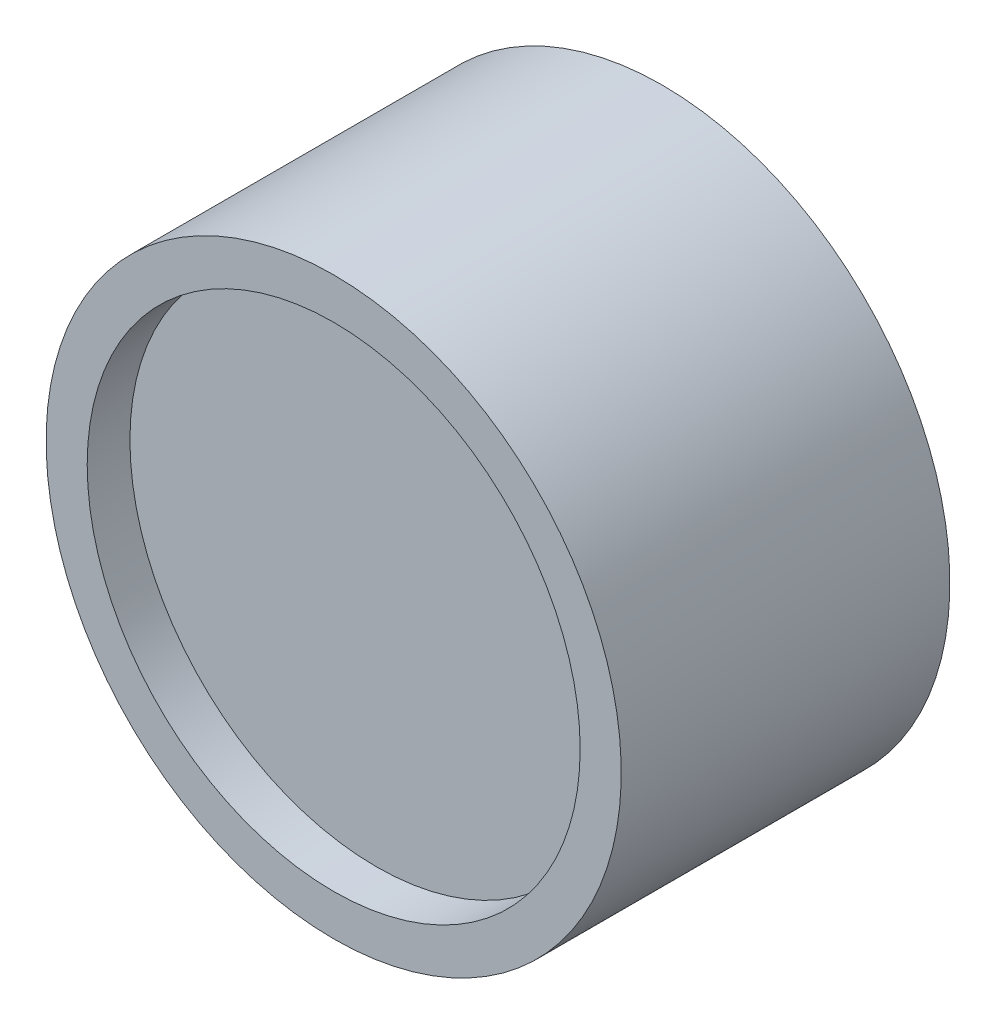
ISO-10303-21;
HEADER;
FILE_DESCRIPTION(('STEP AP214'),'2;1');
FILE_NAME('part.step','',(''),(''),'','','');
FILE_SCHEMA(('AUTOMOTIVE_DESIGN { 1 0 10303 214 1 1 1 1 }'));
ENDSEC;
DATA;
#1=APPLICATION_CONTEXT('core data for automotive mechanical design processes');
#2=APPLICATION_PROTOCOL_DEFINITION('international standard','automotive_design',2000,#1);
#3=PRODUCT_CONTEXT('',#1,'mechanical');
#4=PRODUCT('Part','Part','',(#3));
#5=PRODUCT_RELATED_PRODUCT_CATEGORY('part','',(#4));
#6=PRODUCT_DEFINITION_FORMATION('','',#4);
#7=PRODUCT_DEFINITION_CONTEXT('part definition',#1,'design');
#8=PRODUCT_DEFINITION('design','',#6,#7);
#9=PRODUCT_DEFINITION_SHAPE('','',#8);
#10=(LENGTH_UNIT() NAMED_UNIT(*) SI_UNIT(.MILLI.,.METRE.));
#11=(NAMED_UNIT(*) PLANE_ANGLE_UNIT() SI_UNIT($,.RADIAN.));
#12=(NAMED_UNIT(*) SI_UNIT($,.STERADIAN.) SOLID_ANGLE_UNIT());
#13=UNCERTAINTY_MEASURE_WITH_UNIT(LENGTH_MEASURE(1.E-05),#10,'distance_accuracy_value','');
#14=(GEOMETRIC_REPRESENTATION_CONTEXT(3) GLOBAL_UNCERTAINTY_ASSIGNED_CONTEXT((#13)) GLOBAL_UNIT_ASSIGNED_CONTEXT((#10,
#11,#12)) REPRESENTATION_CONTEXT('',''));
#15=CARTESIAN_POINT('',(0.,0.,0.));
#16=DIRECTION('',(0.,0.,1.));
#17=DIRECTION('',(1.,0.,0.));
#18=AXIS2_PLACEMENT_3D('',#15,#16,#17);
#19=CARTESIAN_POINT('',(0.,22.225,12.7));
#20=DIRECTION('',(0.,0.,-1.));
#21=DIRECTION('',(0.,1.,0.));
#22=AXIS2_PLACEMENT_3D('',#19,#20,#21);
#23=PLANE('',#22);
#24=CARTESIAN_POINT('',(0.,0.,12.7));
#25=DIRECTION('',(0.,0.,1.));
#26=DIRECTION('',(0.,-1.,0.));
#27=AXIS2_PLACEMENT_3D('',#24,#25,#26);
#28=CIRCLE('',#27,19.05);
#29=CARTESIAN_POINT('',(0.,-19.05,12.7));
#30=VERTEX_POINT('',#29);
#31=EDGE_CURVE('E53',#30,#30,#28,.T.);
#32=ORIENTED_EDGE('',*,*,#31,.F.);
#33=EDGE_LOOP('',(#32));
#34=FACE_BOUND('',#33,.T.);
#35=CARTESIAN_POINT('',(0.,0.,12.7));
#36=DIRECTION('',(0.,0.,1.));
#37=DIRECTION('',(0.,-1.,0.));
#38=AXIS2_PLACEMENT_3D('',#35,#36,#37);
#39=CIRCLE('',#38,22.225);
#40=CARTESIAN_POINT('',(0.,-22.225,12.7));
#41=VERTEX_POINT('',#40);
#42=EDGE_CURVE('E66',#41,#41,#39,.T.);
#43=ORIENTED_EDGE('',*,*,#42,.T.);
#44=EDGE_LOOP('',(#43));
#45=FACE_BOUND('',#44,.T.);
#46=ADVANCED_FACE('F41',(#34,#45),#23,.F.);
#47=CARTESIAN_POINT('',(0.,0.,9.398));
#48=DIRECTION('',(0.,0.,1.));
#49=DIRECTION('',(0.,-1.,0.));
#50=AXIS2_PLACEMENT_3D('',#47,#48,#49);
#51=CYLINDRICAL_SURFACE('',#50,19.05);
#52=CARTESIAN_POINT('',(0.,0.,9.398));
#53=DIRECTION('',(0.,0.,1.));
#54=DIRECTION('',(0.,-1.,0.));
#55=AXIS2_PLACEMENT_3D('',#52,#53,#54);
#56=CIRCLE('',#55,19.05);
#57=CARTESIAN_POINT('',(0.,-19.05,9.398));
#58=VERTEX_POINT('',#57);
#59=EDGE_CURVE('E85',#58,#58,#56,.T.);
#60=ORIENTED_EDGE('',*,*,#59,.F.);
#61=EDGE_LOOP('',(#60));
#62=FACE_BOUND('',#61,.T.);
#63=ORIENTED_EDGE('',*,*,#31,.T.);
#64=EDGE_LOOP('',(#63));
#65=FACE_BOUND('',#64,.T.);
#66=ADVANCED_FACE('F93',(#62,#65),#51,.F.);
#67=CARTESIAN_POINT('',(0.,19.05,9.398));
#68=DIRECTION('',(0.,0.,-1.));
#69=DIRECTION('',(0.,1.,0.));
#70=AXIS2_PLACEMENT_3D('',#67,#68,#69);
#71=PLANE('',#70);
#72=ORIENTED_EDGE('',*,*,#59,.T.);
#73=EDGE_LOOP('',(#72));
#74=FACE_BOUND('',#73,.T.);
#75=ADVANCED_FACE('F119',(#74),#71,.F.);
#76=CARTESIAN_POINT('',(0.,0.,-9.398));
#77=DIRECTION('',(0.,0.,1.));
#78=DIRECTION('',(0.,-1.,0.));
#79=AXIS2_PLACEMENT_3D('',#76,#77,#78);
#80=PLANE('',#79);
#81=CARTESIAN_POINT('',(0.,0.,-9.398));
#82=DIRECTION('',(0.,0.,1.));
#83=DIRECTION('',(0.,-1.,0.));
#84=AXIS2_PLACEMENT_3D('',#81,#82,#83);
#85=CIRCLE('',#84,19.05);
#86=CARTESIAN_POINT('',(0.,-19.05,-9.398));
#87=VERTEX_POINT('',#86);
#88=EDGE_CURVE('E81',#87,#87,#85,.T.);
#89=ORIENTED_EDGE('',*,*,#88,.F.);
#90=EDGE_LOOP('',(#89));
#91=FACE_BOUND('',#90,.T.);
#92=ADVANCED_FACE('F114',(#91),#80,.F.);
#93=CARTESIAN_POINT('',(0.,0.,9.398));
#94=DIRECTION('',(0.,0.,1.));
#95=DIRECTION('',(0.,-1.,0.));
#96=AXIS2_PLACEMENT_3D('',#93,#94,#95);
#97=CYLINDRICAL_SURFACE('',#96,19.05);
#98=CARTESIAN_POINT('',(0.,0.,-12.7));
#99=DIRECTION('',(0.,0.,1.));
#100=DIRECTION('',(0.,-1.,0.));
#101=AXIS2_PLACEMENT_3D('',#98,#99,#100);
#102=CIRCLE('',#101,19.05);
#103=CARTESIAN_POINT('',(0.,-19.05,-12.7));
#104=VERTEX_POINT('',#103);
#105=EDGE_CURVE('E77',#104,#104,#102,.T.);
#106=ORIENTED_EDGE('',*,*,#105,.F.);
#107=EDGE_LOOP('',(#106));
#108=FACE_BOUND('',#107,.T.);
#109=ORIENTED_EDGE('',*,*,#88,.T.);
#110=EDGE_LOOP('',(#109));
#111=FACE_BOUND('',#110,.T.);
#112=ADVANCED_FACE('F108',(#108,#111),#97,.F.);
#113=CARTESIAN_POINT('',(0.,19.05,-12.7));
#114=DIRECTION('',(0.,0.,1.));
#115=DIRECTION('',(0.,-1.,0.));
#116=AXIS2_PLACEMENT_3D('',#113,#114,#115);
#117=PLANE('',#116);
#118=CARTESIAN_POINT('',(0.,0.,-12.7));
#119=DIRECTION('',(0.,0.,1.));
#120=DIRECTION('',(0.,-1.,0.));
#121=AXIS2_PLACEMENT_3D('',#118,#119,#120);
#122=CIRCLE('',#121,22.225);
#123=CARTESIAN_POINT('',(0.,-22.225,-12.7));
#124=VERTEX_POINT('',#123);
#125=EDGE_CURVE('E71',#124,#124,#122,.T.);
#126=ORIENTED_EDGE('',*,*,#125,.F.);
#127=EDGE_LOOP('',(#126));
#128=FACE_BOUND('',#127,.T.);
#129=ORIENTED_EDGE('',*,*,#105,.T.);
#130=EDGE_LOOP('',(#129));
#131=FACE_BOUND('',#130,.T.);
#132=ADVANCED_FACE('F102',(#128,#131),#117,.F.);
#133=CARTESIAN_POINT('',(0.,0.,9.398));
#134=DIRECTION('',(0.,0.,1.));
#135=DIRECTION('',(0.,-1.,0.));
#136=AXIS2_PLACEMENT_3D('',#133,#134,#135);
#137=CYLINDRICAL_SURFACE('',#136,22.225);
#138=CARTESIAN_POINT('',(0.,-22.225,-1.5875));
#139=CARTESIAN_POINT('',(-0.0890487798453097,-22.2249992505102,-1.58749609264575));
#140=CARTESIAN_POINT('',(-0.178159230469295,-22.2244590967661,-1.57998219641667));
#141=CARTESIAN_POINT('',(-0.353917635489172,-22.2223562476493,-1.55011672192261));
#142=CARTESIAN_POINT('',(-0.440562633778054,-22.2207923746226,-1.52774805477269));
#143=CARTESIAN_POINT('',(-0.608818958371997,-22.2168189279091,-1.46882052945945));
#144=CARTESIAN_POINT('',(-0.690432988297746,-22.2144098131927,-1.43226937132089));
#145=CARTESIAN_POINT('',(-0.846346733612163,-22.209016530152,-1.34602742457319));
#146=CARTESIAN_POINT('',(-0.920648075413193,-22.2060324901352,-1.29633956679639));
#147=CARTESIAN_POINT('',(-1.05998999170469,-22.1998181704503,-1.18513134139653));
#148=CARTESIAN_POINT('',(-1.12501469630089,-22.1965874829864,-1.12359111017904));
#149=CARTESIAN_POINT('',(-1.24382158914945,-22.1902474420535,-0.990466517408903));
#150=CARTESIAN_POINT('',(-1.29760329834655,-22.1871380937593,-0.91888172808256));
#151=CARTESIAN_POINT('',(-1.39244884206196,-22.1813881326419,-0.767607077207272));
#152=CARTESIAN_POINT('',(-1.4334991146123,-22.1787480209346,-0.687908691951817));
#153=CARTESIAN_POINT('',(-1.50162982074142,-22.1742396816116,-0.522728798321746));
#154=CARTESIAN_POINT('',(-1.52871044238854,-22.1723714436044,-0.437247367819697));
#155=CARTESIAN_POINT('',(-1.56808808720032,-22.1696215072539,-0.263083904389129));
#156=CARTESIAN_POINT('',(-1.5804104784373,-22.1687381162285,-0.174407634237693));
#157=CARTESIAN_POINT('',(-1.59000021081584,-22.1680524315257,0.00375869203487901));
#158=CARTESIAN_POINT('',(-1.58726776650484,-22.1682501224418,0.0932487365407181));
#159=CARTESIAN_POINT('',(-1.5668464040474,-22.1697027374792,0.270329075308128));
#160=CARTESIAN_POINT('',(-1.54918498269758,-22.1709557179102,0.357922558736071));
#161=CARTESIAN_POINT('',(-1.4994496868059,-22.1743746638034,0.528898534779351));
#162=CARTESIAN_POINT('',(-1.46737570439987,-22.1765406360985,0.61228099587404));
#163=CARTESIAN_POINT('',(-1.38969470144195,-22.1815437306027,0.772556071415623));
#164=CARTESIAN_POINT('',(-1.34407526138189,-22.1843814682512,0.849442646472423));
#165=CARTESIAN_POINT('',(-1.24060729011335,-22.1904077269116,0.994477391924973));
#166=CARTESIAN_POINT('',(-1.18275857799097,-22.1935962531125,1.06262543302314));
#167=CARTESIAN_POINT('',(-1.0563195629451,-22.1999734282712,1.18840857781702));
#168=CARTESIAN_POINT('',(-0.987705473474704,-22.2031620614841,1.24601977444661));
#169=CARTESIAN_POINT('',(-0.841766632911358,-22.2091732949878,1.34890928276389));
#170=CARTESIAN_POINT('',(-0.764441877818136,-22.2119958951105,1.39418758878779));
#171=CARTESIAN_POINT('',(-0.603261759910872,-22.2169573533996,1.47112421961275));
#172=CARTESIAN_POINT('',(-0.519405934472632,-22.2190961630752,1.50278157854457));
#173=CARTESIAN_POINT('',(-0.347550767268376,-22.2224484329266,1.55156140764981));
#174=CARTESIAN_POINT('',(-0.259551488702718,-22.2236619072117,1.5686840994457));
#175=CARTESIAN_POINT('',(-0.0821147353008575,-22.225024960202,1.5878787828138));
#176=CARTESIAN_POINT('',(0.0073191480602109,-22.2251768744895,1.58998381557814));
#177=CARTESIAN_POINT('',(0.185268660784769,-22.2244059124829,1.57916984681903));
#178=CARTESIAN_POINT('',(0.273784296409174,-22.2234830435218,1.5662509478017));
#179=CARTESIAN_POINT('',(0.447291156480128,-22.2206678673679,1.52578320456596));
#180=CARTESIAN_POINT('',(0.532285948667429,-22.2187765688341,1.49824958109011));
#181=CARTESIAN_POINT('',(0.696448708516856,-22.2142371838267,1.42934945946168));
#182=CARTESIAN_POINT('',(0.775616607956302,-22.211589088494,1.38798279937995));
#183=CARTESIAN_POINT('',(0.926029235370733,-22.2058275571246,1.2925071647473));
#184=CARTESIAN_POINT('',(0.997259969190538,-22.2027133211846,1.23837619275805));
#185=CARTESIAN_POINT('',(1.12963525884952,-22.1963724429854,1.11894043615397));
#186=CARTESIAN_POINT('',(1.19077968566528,-22.1931457992889,1.05363550862436));
#187=CARTESIAN_POINT('',(1.30135918063973,-22.1869369396489,0.913562726582341));
#188=CARTESIAN_POINT('',(1.35077276342894,-22.1839551786465,0.838777887660954));
#189=CARTESIAN_POINT('',(1.4363407997941,-22.1785796677168,0.681953181825272));
#190=CARTESIAN_POINT('',(1.47249535528283,-22.1761859132699,0.599913370680836));
#191=CARTESIAN_POINT('',(1.530482072823,-22.1722596801863,0.430985059553199));
#192=CARTESIAN_POINT('',(1.55232761141387,-22.1707263973451,0.344101170678667));
#193=CARTESIAN_POINT('',(1.58111981510363,-22.1686918130773,0.167887330420396));
#194=CARTESIAN_POINT('',(1.58806668223353,-22.1681904976567,0.0785574122222734));
#195=CARTESIAN_POINT('',(1.58686226608574,-22.1682767293873,-0.0997991718701193));
#196=CARTESIAN_POINT('',(1.57874475114552,-22.1688618412033,-0.188826068934857));
#197=CARTESIAN_POINT('',(1.547712169485,-22.1710498314045,-0.364249082777615));
#198=CARTESIAN_POINT('',(1.52479707742355,-22.1726527115328,-0.450645195050099));
#199=CARTESIAN_POINT('',(1.46482783203581,-22.1766950052155,-0.618358032604096));
#200=CARTESIAN_POINT('',(1.42777402040651,-22.1791343985534,-0.699674880583282));
#201=CARTESIAN_POINT('',(1.34058334626267,-22.1845748411356,-0.854938412299932));
#202=CARTESIAN_POINT('',(1.29044676981647,-22.1875758780985,-0.928885257141375));
#203=CARTESIAN_POINT('',(1.17838765718374,-22.1938093700963,-1.06748184562946));
#204=CARTESIAN_POINT('',(1.11644038266148,-22.1970423018232,-1.13211156581269));
#205=CARTESIAN_POINT('',(0.982557854313685,-22.2033710565752,-1.25007889698802));
#206=CARTESIAN_POINT('',(0.91062017137124,-22.2064668460125,-1.30341375370422));
#207=CARTESIAN_POINT('',(0.758694924433831,-22.2121766171986,-1.39732913263439));
#208=CARTESIAN_POINT('',(0.678695608697483,-22.2147898793735,-1.43789066903972));
#209=CARTESIAN_POINT('',(0.513060219064313,-22.2192310743367,-1.50495541558782));
#210=CARTESIAN_POINT('',(0.427430829765423,-22.2210599197177,-1.53147497068465));
#211=CARTESIAN_POINT('',(0.284403979128168,-22.2232507898786,-1.56286471313322));
#212=CARTESIAN_POINT('',(0.227929277558056,-22.2239038006581,-1.5720908696232));
#213=CARTESIAN_POINT('',(0.114311522402901,-22.2247786459001,-1.58440976158887));
#214=CARTESIAN_POINT('',(0.0571684700624521,-22.2250004811653,-1.58750250848428));
#215=CARTESIAN_POINT('',(0.,-22.225,-1.5875));
#216=B_SPLINE_CURVE_WITH_KNOTS('',3,(#138,#139,#140,#141,#142,#143,#144,#145,#146,#147,#148,
#149,#150,#151,#152,#153,#154,#155,#156,#157,#158,#159,#160,#161,#162,#163,#164,#165,#166,#167,
#168,#169,#170,#171,#172,#173,#174,#175,#176,#177,#178,#179,#180,#181,#182,#183,#184,#185,#186,
#187,#188,#189,#190,#191,#192,#193,#194,#195,#196,#197,#198,#199,#200,#201,#202,#203,#204,#205,
#206,#207,#208,#209,#210,#211,#212,#213,#214,#215),.UNSPECIFIED.,.T.,.F.,(4,2,2,2,2,2,2,2,2,2,2,
2,2,2,2,2,2,2,2,2,2,2,2,2,2,2,2,2,2,2,2,2,2,2,2,2,2,2,4),(0.,0.266937629617519,
0.534182876696861,0.801283232291635,1.06832404730501,1.33581635740702,1.60332006282592,
1.87110775144004,2.13889183483149,2.40621495777005,2.67353427107933,2.94036229494989,
3.20719231580492,3.47426774622431,3.74134712790408,4.00902516602322,4.27670332707105,
4.54440046620521,4.81209352345952,5.07919743208781,5.3462995183153,5.61312397097012,
5.87995154717379,6.14724236669454,6.4145366051181,6.68231668736605,6.95009471133464,
7.21762204897356,7.48514575882872,7.75207051143207,8.01899572115044,8.28591448037198,
8.55282740362447,8.82030566186755,9.08784907032429,9.35578828905135,9.62341493539113,
9.79478667487055,9.96615809527451),.UNSPECIFIED.);
#217=CARTESIAN_POINT('',(0.,-22.225,-1.5875));
#218=VERTEX_POINT('',#217);
#219=EDGE_CURVE('E11',#218,#218,#216,.T.);
#220=ORIENTED_EDGE('',*,*,#219,.T.);
#221=EDGE_LOOP('',(#220));
#222=FACE_BOUND('',#221,.T.);
#223=ORIENTED_EDGE('',*,*,#42,.F.);
#224=EDGE_LOOP('',(#223));
#225=FACE_BOUND('',#224,.T.);
#226=ORIENTED_EDGE('',*,*,#125,.T.);
#227=EDGE_LOOP('',(#226));
#228=FACE_BOUND('',#227,.T.);
#229=ADVANCED_FACE('F99',(#222,#225,#228),#137,.T.);
#230=CARTESIAN_POINT('',(0.,-22.225,0.));
#231=DIRECTION('',(0.,-1.,0.));
#232=DIRECTION('',(0.,0.,-1.));
#233=AXIS2_PLACEMENT_3D('',#230,#231,#232);
#234=CYLINDRICAL_SURFACE('',#233,1.5875);
#235=CARTESIAN_POINT('',(0.,-6.223,0.));
#236=DIRECTION('',(0.,-1.,0.));
#237=DIRECTION('',(0.,0.,-1.));
#238=AXIS2_PLACEMENT_3D('',#235,#236,#237);
#239=CIRCLE('',#238,1.5875);
#240=CARTESIAN_POINT('',(0.,-6.223,-1.5875));
#241=VERTEX_POINT('',#240);
#242=EDGE_CURVE('E63',#241,#241,#239,.T.);
#243=ORIENTED_EDGE('',*,*,#242,.F.);
#244=EDGE_LOOP('',(#243));
#245=FACE_BOUND('',#244,.T.);
#246=ORIENTED_EDGE('',*,*,#219,.F.);
#247=EDGE_LOOP('',(#246));
#248=FACE_BOUND('',#247,.T.);
#249=ADVANCED_FACE('F59',(#245,#248),#234,.F.);
#250=CARTESIAN_POINT('',(0.,-6.223,0.));
#251=DIRECTION('',(0.,-1.,0.));
#252=DIRECTION('',(0.,0.,-1.));
#253=AXIS2_PLACEMENT_3D('',#250,#251,#252);
#254=CONICAL_SURFACE('',#253,1.5875,1.02974425867665);
#255=CARTESIAN_POINT('',(0.,-5.26913376729375,0.));
#256=VERTEX_POINT('',#255);
#257=VERTEX_LOOP('',#256);
#258=FACE_BOUND('',#257,.T.);
#259=ORIENTED_EDGE('',*,*,#242,.T.);
#260=EDGE_LOOP('',(#259));
#261=FACE_BOUND('',#260,.T.);
#262=ADVANCED_FACE('F56',(#258,#261),#254,.F.);
#263=CLOSED_SHELL('',(#46,#66,#75,#92,#112,#132,#229,#249,#262));
#264=MANIFOLD_SOLID_BREP('B2',#263);
#265=ADVANCED_BREP_SHAPE_REPRESENTATION('',(#18,#264),#14);
#266=SHAPE_DEFINITION_REPRESENTATION(#9,#265);
ENDSEC;
END-ISO-10303-21;
